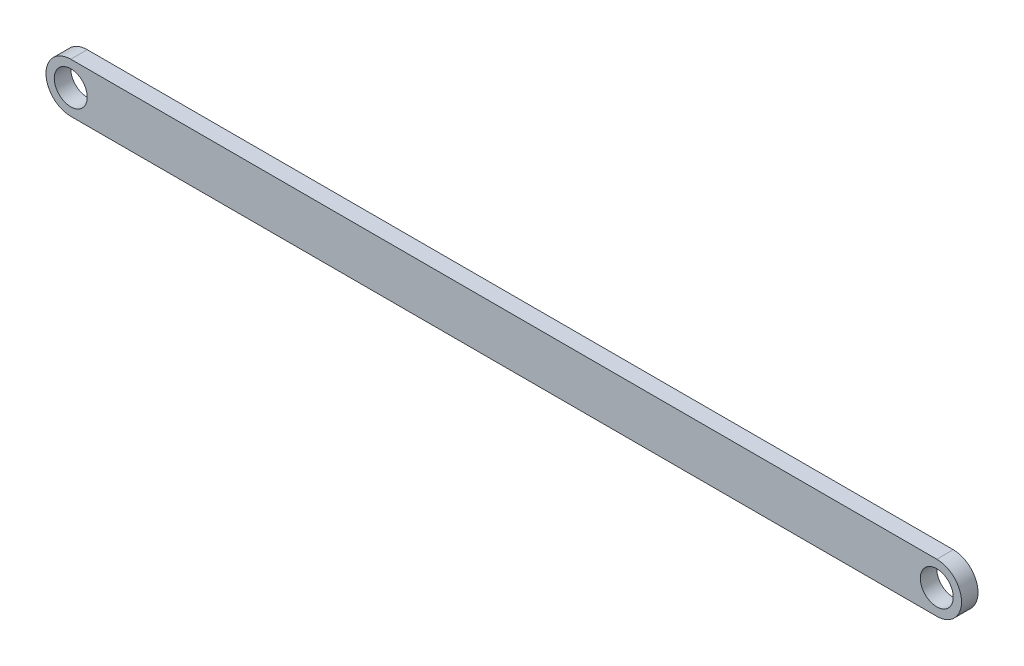
ISO-10303-21;
HEADER;
FILE_DESCRIPTION(('STEP AP214'),'2;1');
FILE_NAME('part.step','',(''),(''),'','','');
FILE_SCHEMA(('AUTOMOTIVE_DESIGN { 1 0 10303 214 1 1 1 1 }'));
ENDSEC;
DATA;
#1=APPLICATION_CONTEXT('core data for automotive mechanical design processes');
#2=APPLICATION_PROTOCOL_DEFINITION('international standard','automotive_design',2000,#1);
#3=PRODUCT_CONTEXT('',#1,'mechanical');
#4=PRODUCT('Part','Part','',(#3));
#5=PRODUCT_RELATED_PRODUCT_CATEGORY('part','',(#4));
#6=PRODUCT_DEFINITION_FORMATION('','',#4);
#7=PRODUCT_DEFINITION_CONTEXT('part definition',#1,'design');
#8=PRODUCT_DEFINITION('design','',#6,#7);
#9=PRODUCT_DEFINITION_SHAPE('','',#8);
#10=(LENGTH_UNIT() NAMED_UNIT(*) SI_UNIT(.MILLI.,.METRE.));
#11=(NAMED_UNIT(*) PLANE_ANGLE_UNIT() SI_UNIT($,.RADIAN.));
#12=(NAMED_UNIT(*) SI_UNIT($,.STERADIAN.) SOLID_ANGLE_UNIT());
#13=UNCERTAINTY_MEASURE_WITH_UNIT(LENGTH_MEASURE(1.E-05),#10,'distance_accuracy_value','');
#14=(GEOMETRIC_REPRESENTATION_CONTEXT(3) GLOBAL_UNCERTAINTY_ASSIGNED_CONTEXT((#13)) GLOBAL_UNIT_ASSIGNED_CONTEXT((#10,
#11,#12)) REPRESENTATION_CONTEXT('',''));
#15=CARTESIAN_POINT('',(0.,0.,0.));
#16=DIRECTION('',(0.,0.,1.));
#17=DIRECTION('',(1.,0.,0.));
#18=AXIS2_PLACEMENT_3D('',#15,#16,#17);
#19=CARTESIAN_POINT('',(0.,30.,10.));
#20=DIRECTION('',(0.,-1.,0.));
#21=DIRECTION('',(1.,0.,0.));
#22=AXIS2_PLACEMENT_3D('',#19,#20,#21);
#23=PLANE('',#22);
#24=DIRECTION('',(-1.,0.,0.));
#25=VECTOR('',#24,1.);
#26=CARTESIAN_POINT('',(0.,30.,0.));
#27=LINE('',#26,#25);
#28=CARTESIAN_POINT('',(0.,30.,0.));
#29=VERTEX_POINT('',#28);
#30=CARTESIAN_POINT('',(-525.,29.9999999999999,0.));
#31=VERTEX_POINT('',#30);
#32=EDGE_CURVE('E106',#29,#31,#27,.T.);
#33=ORIENTED_EDGE('',*,*,#32,.T.);
#34=DIRECTION('',(0.,0.,-1.));
#35=VECTOR('',#34,1.);
#36=CARTESIAN_POINT('',(-525.,29.9999999999999,10.));
#37=LINE('',#36,#35);
#38=CARTESIAN_POINT('',(-525.,29.9999999999999,10.));
#39=VERTEX_POINT('',#38);
#40=EDGE_CURVE('E11',#39,#31,#37,.T.);
#41=ORIENTED_EDGE('',*,*,#40,.F.);
#42=DIRECTION('',(-1.,0.,0.));
#43=VECTOR('',#42,1.);
#44=CARTESIAN_POINT('',(0.,30.,10.));
#45=LINE('',#44,#43);
#46=CARTESIAN_POINT('',(0.,30.,10.));
#47=VERTEX_POINT('',#46);
#48=EDGE_CURVE('E87',#47,#39,#45,.T.);
#49=ORIENTED_EDGE('',*,*,#48,.F.);
#50=DIRECTION('',(0.,0.,-1.));
#51=VECTOR('',#50,1.);
#52=CARTESIAN_POINT('',(0.,30.,10.));
#53=LINE('',#52,#51);
#54=EDGE_CURVE('E102',#47,#29,#53,.T.);
#55=ORIENTED_EDGE('',*,*,#54,.T.);
#56=EDGE_LOOP('',(#33,#41,#49,#55));
#57=FACE_BOUND('',#56,.T.);
#58=ADVANCED_FACE('F39',(#57),#23,.F.);
#59=CARTESIAN_POINT('',(-525.,14.9999999999999,10.));
#60=DIRECTION('',(0.,0.,-1.));
#61=DIRECTION('',(-1.,0.,0.));
#62=AXIS2_PLACEMENT_3D('',#59,#60,#61);
#63=CYLINDRICAL_SURFACE('',#62,15.);
#64=CARTESIAN_POINT('',(-525.,14.9999999999999,0.));
#65=DIRECTION('',(0.,0.,1.));
#66=DIRECTION('',(1.,0.,0.));
#67=AXIS2_PLACEMENT_3D('',#64,#65,#66);
#68=CIRCLE('',#67,15.);
#69=CARTESIAN_POINT('',(-525.,0.,0.));
#70=VERTEX_POINT('',#69);
#71=EDGE_CURVE('E93',#31,#70,#68,.T.);
#72=ORIENTED_EDGE('',*,*,#71,.T.);
#73=DIRECTION('',(0.,0.,-1.));
#74=VECTOR('',#73,1.);
#75=CARTESIAN_POINT('',(-525.,0.,10.));
#76=LINE('',#75,#74);
#77=CARTESIAN_POINT('',(-525.,0.,10.));
#78=VERTEX_POINT('',#77);
#79=EDGE_CURVE('E48',#78,#70,#76,.T.);
#80=ORIENTED_EDGE('',*,*,#79,.F.);
#81=CARTESIAN_POINT('',(-525.,14.9999999999999,10.));
#82=DIRECTION('',(0.,0.,1.));
#83=DIRECTION('',(1.,0.,0.));
#84=AXIS2_PLACEMENT_3D('',#81,#82,#83);
#85=CIRCLE('',#84,15.);
#86=EDGE_CURVE('E82',#39,#78,#85,.T.);
#87=ORIENTED_EDGE('',*,*,#86,.F.);
#88=ORIENTED_EDGE('',*,*,#40,.T.);
#89=EDGE_LOOP('',(#72,#80,#87,#88));
#90=FACE_BOUND('',#89,.T.);
#91=ADVANCED_FACE('F92',(#90),#63,.T.);
#92=CARTESIAN_POINT('',(0.,0.,10.));
#93=DIRECTION('',(0.,-1.,0.));
#94=DIRECTION('',(1.,0.,0.));
#95=AXIS2_PLACEMENT_3D('',#92,#93,#94);
#96=PLANE('',#95);
#97=DIRECTION('',(-1.,0.,0.));
#98=VECTOR('',#97,1.);
#99=CARTESIAN_POINT('',(0.,0.,0.));
#100=LINE('',#99,#98);
#101=CARTESIAN_POINT('',(0.,0.,0.));
#102=VERTEX_POINT('',#101);
#103=EDGE_CURVE('E113',#102,#70,#100,.T.);
#104=ORIENTED_EDGE('',*,*,#103,.F.);
#105=DIRECTION('',(0.,0.,-1.));
#106=VECTOR('',#105,1.);
#107=CARTESIAN_POINT('',(0.,0.,10.));
#108=LINE('',#107,#106);
#109=CARTESIAN_POINT('',(0.,0.,10.));
#110=VERTEX_POINT('',#109);
#111=EDGE_CURVE('E72',#110,#102,#108,.T.);
#112=ORIENTED_EDGE('',*,*,#111,.F.);
#113=DIRECTION('',(-1.,0.,0.));
#114=VECTOR('',#113,1.);
#115=CARTESIAN_POINT('',(0.,0.,10.));
#116=LINE('',#115,#114);
#117=EDGE_CURVE('E85',#110,#78,#116,.T.);
#118=ORIENTED_EDGE('',*,*,#117,.T.);
#119=ORIENTED_EDGE('',*,*,#79,.T.);
#120=EDGE_LOOP('',(#104,#112,#118,#119));
#121=FACE_BOUND('',#120,.T.);
#122=ADVANCED_FACE('F98',(#121),#96,.T.);
#123=CARTESIAN_POINT('',(0.,15.,10.));
#124=DIRECTION('',(0.,0.,-1.));
#125=DIRECTION('',(-1.,0.,0.));
#126=AXIS2_PLACEMENT_3D('',#123,#124,#125);
#127=CYLINDRICAL_SURFACE('',#126,15.);
#128=CARTESIAN_POINT('',(0.,15.,0.));
#129=DIRECTION('',(0.,0.,1.));
#130=DIRECTION('',(1.,0.,0.));
#131=AXIS2_PLACEMENT_3D('',#128,#129,#130);
#132=CIRCLE('',#131,15.);
#133=EDGE_CURVE('E75',#102,#29,#132,.T.);
#134=ORIENTED_EDGE('',*,*,#133,.T.);
#135=ORIENTED_EDGE('',*,*,#54,.F.);
#136=CARTESIAN_POINT('',(0.,15.,10.));
#137=DIRECTION('',(0.,0.,1.));
#138=DIRECTION('',(1.,0.,0.));
#139=AXIS2_PLACEMENT_3D('',#136,#137,#138);
#140=CIRCLE('',#139,15.);
#141=EDGE_CURVE('E56',#110,#47,#140,.T.);
#142=ORIENTED_EDGE('',*,*,#141,.F.);
#143=ORIENTED_EDGE('',*,*,#111,.T.);
#144=EDGE_LOOP('',(#134,#135,#142,#143));
#145=FACE_BOUND('',#144,.T.);
#146=ADVANCED_FACE('F136',(#145),#127,.T.);
#147=CARTESIAN_POINT('',(-525.,14.9999999999999,10.));
#148=DIRECTION('',(0.,0.,1.));
#149=DIRECTION('',(1.,0.,0.));
#150=AXIS2_PLACEMENT_3D('',#147,#148,#149);
#151=PLANE('',#150);
#152=CARTESIAN_POINT('',(0.,15.,10.));
#153=DIRECTION('',(0.,0.,-1.));
#154=DIRECTION('',(-1.,0.,0.));
#155=AXIS2_PLACEMENT_3D('',#152,#153,#154);
#156=CIRCLE('',#155,10.);
#157=CARTESIAN_POINT('',(-10.,15.,10.));
#158=VERTEX_POINT('',#157);
#159=EDGE_CURVE('E110',#158,#158,#156,.T.);
#160=ORIENTED_EDGE('',*,*,#159,.T.);
#161=EDGE_LOOP('',(#160));
#162=FACE_BOUND('',#161,.T.);
#163=CARTESIAN_POINT('',(-525.,14.9999999999999,10.));
#164=DIRECTION('',(0.,0.,-1.));
#165=DIRECTION('',(-1.,0.,0.));
#166=AXIS2_PLACEMENT_3D('',#163,#164,#165);
#167=CIRCLE('',#166,9.99999999999998);
#168=CARTESIAN_POINT('',(-535.,14.9999999999999,10.));
#169=VERTEX_POINT('',#168);
#170=EDGE_CURVE('E188',#169,#169,#167,.T.);
#171=ORIENTED_EDGE('',*,*,#170,.T.);
#172=EDGE_LOOP('',(#171));
#173=FACE_BOUND('',#172,.T.);
#174=ORIENTED_EDGE('',*,*,#48,.T.);
#175=ORIENTED_EDGE('',*,*,#86,.T.);
#176=ORIENTED_EDGE('',*,*,#117,.F.);
#177=ORIENTED_EDGE('',*,*,#141,.T.);
#178=EDGE_LOOP('',(#174,#175,#176,#177));
#179=FACE_BOUND('',#178,.T.);
#180=ADVANCED_FACE('F83',(#162,#173,#179),#151,.T.);
#181=CARTESIAN_POINT('',(-525.,14.9999999999999,0.));
#182=DIRECTION('',(0.,0.,1.));
#183=DIRECTION('',(1.,0.,0.));
#184=AXIS2_PLACEMENT_3D('',#181,#182,#183);
#185=PLANE('',#184);
#186=CARTESIAN_POINT('',(0.,15.,0.));
#187=DIRECTION('',(0.,0.,-1.));
#188=DIRECTION('',(-1.,0.,0.));
#189=AXIS2_PLACEMENT_3D('',#186,#187,#188);
#190=CIRCLE('',#189,10.);
#191=CARTESIAN_POINT('',(-10.,15.,0.));
#192=VERTEX_POINT('',#191);
#193=EDGE_CURVE('E186',#192,#192,#190,.T.);
#194=ORIENTED_EDGE('',*,*,#193,.F.);
#195=EDGE_LOOP('',(#194));
#196=FACE_BOUND('',#195,.T.);
#197=CARTESIAN_POINT('',(-525.,14.9999999999999,0.));
#198=DIRECTION('',(0.,0.,-1.));
#199=DIRECTION('',(-1.,0.,0.));
#200=AXIS2_PLACEMENT_3D('',#197,#198,#199);
#201=CIRCLE('',#200,9.99999999999998);
#202=CARTESIAN_POINT('',(-535.,14.9999999999999,0.));
#203=VERTEX_POINT('',#202);
#204=EDGE_CURVE('E194',#203,#203,#201,.T.);
#205=ORIENTED_EDGE('',*,*,#204,.F.);
#206=EDGE_LOOP('',(#205));
#207=FACE_BOUND('',#206,.T.);
#208=ORIENTED_EDGE('',*,*,#32,.F.);
#209=ORIENTED_EDGE('',*,*,#133,.F.);
#210=ORIENTED_EDGE('',*,*,#103,.T.);
#211=ORIENTED_EDGE('',*,*,#71,.F.);
#212=EDGE_LOOP('',(#208,#209,#210,#211));
#213=FACE_BOUND('',#212,.T.);
#214=ADVANCED_FACE('F124',(#196,#207,#213),#185,.F.);
#215=CARTESIAN_POINT('',(-525.,14.9999999999999,10.));
#216=DIRECTION('',(0.,0.,-1.));
#217=DIRECTION('',(-1.,0.,0.));
#218=AXIS2_PLACEMENT_3D('',#215,#216,#217);
#219=CYLINDRICAL_SURFACE('',#218,9.99999999999998);
#220=ORIENTED_EDGE('',*,*,#170,.F.);
#221=EDGE_LOOP('',(#220));
#222=FACE_BOUND('',#221,.T.);
#223=ORIENTED_EDGE('',*,*,#204,.T.);
#224=EDGE_LOOP('',(#223));
#225=FACE_BOUND('',#224,.T.);
#226=ADVANCED_FACE('F126',(#222,#225),#219,.F.);
#227=CARTESIAN_POINT('',(0.,15.,10.));
#228=DIRECTION('',(0.,0.,-1.));
#229=DIRECTION('',(-1.,0.,0.));
#230=AXIS2_PLACEMENT_3D('',#227,#228,#229);
#231=CYLINDRICAL_SURFACE('',#230,10.);
#232=ORIENTED_EDGE('',*,*,#159,.F.);
#233=EDGE_LOOP('',(#232));
#234=FACE_BOUND('',#233,.T.);
#235=ORIENTED_EDGE('',*,*,#193,.T.);
#236=EDGE_LOOP('',(#235));
#237=FACE_BOUND('',#236,.T.);
#238=ADVANCED_FACE('F133',(#234,#237),#231,.F.);
#239=CLOSED_SHELL('',(#58,#91,#122,#146,#180,#214,#226,#238));
#240=MANIFOLD_SOLID_BREP('B2',#239);
#241=ADVANCED_BREP_SHAPE_REPRESENTATION('',(#18,#240),#14);
#242=SHAPE_DEFINITION_REPRESENTATION(#9,#241);
ENDSEC;
END-ISO-10303-21;
